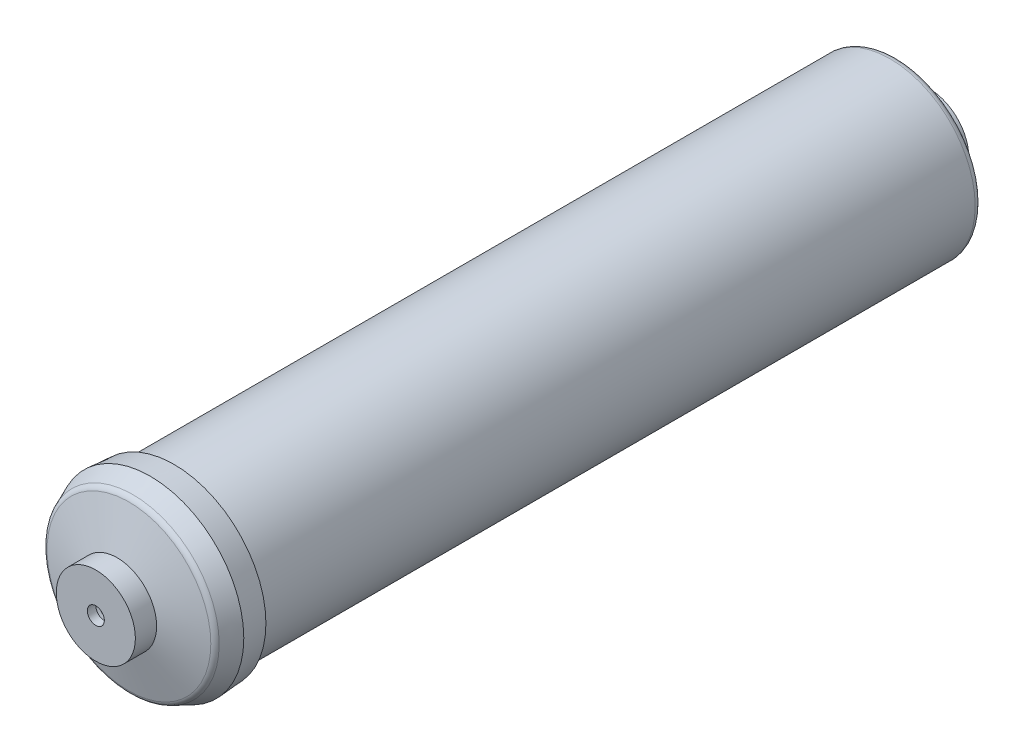
ISO-10303-21;
HEADER;
FILE_DESCRIPTION(('STEP AP214'),'2;1');
FILE_NAME('part.step','',(''),(''),'','','');
FILE_SCHEMA(('AUTOMOTIVE_DESIGN { 1 0 10303 214 1 1 1 1 }'));
ENDSEC;
DATA;
#1=APPLICATION_CONTEXT('core data for automotive mechanical design processes');
#2=APPLICATION_PROTOCOL_DEFINITION('international standard','automotive_design',2000,#1);
#3=PRODUCT_CONTEXT('',#1,'mechanical');
#4=PRODUCT('Part','Part','',(#3));
#5=PRODUCT_RELATED_PRODUCT_CATEGORY('part','',(#4));
#6=PRODUCT_DEFINITION_FORMATION('','',#4);
#7=PRODUCT_DEFINITION_CONTEXT('part definition',#1,'design');
#8=PRODUCT_DEFINITION('design','',#6,#7);
#9=PRODUCT_DEFINITION_SHAPE('','',#8);
#10=(LENGTH_UNIT() NAMED_UNIT(*) SI_UNIT(.MILLI.,.METRE.));
#11=(NAMED_UNIT(*) PLANE_ANGLE_UNIT() SI_UNIT($,.RADIAN.));
#12=(NAMED_UNIT(*) SI_UNIT($,.STERADIAN.) SOLID_ANGLE_UNIT());
#13=UNCERTAINTY_MEASURE_WITH_UNIT(LENGTH_MEASURE(1.E-05),#10,'distance_accuracy_value','');
#14=(GEOMETRIC_REPRESENTATION_CONTEXT(3) GLOBAL_UNCERTAINTY_ASSIGNED_CONTEXT((#13)) GLOBAL_UNIT_ASSIGNED_CONTEXT((#10,
#11,#12)) REPRESENTATION_CONTEXT('',''));
#15=CARTESIAN_POINT('',(0.,0.,0.));
#16=DIRECTION('',(0.,0.,1.));
#17=DIRECTION('',(1.,0.,0.));
#18=AXIS2_PLACEMENT_3D('',#15,#16,#17);
#19=CARTESIAN_POINT('',(0.,3.175,-3.175));
#20=DIRECTION('',(0.,0.,1.));
#21=DIRECTION('',(1.,0.,0.));
#22=AXIS2_PLACEMENT_3D('',#19,#20,#21);
#23=PLANE('',#22);
#24=CARTESIAN_POINT('',(0.,0.,-3.175));
#25=DIRECTION('',(0.,0.,1.));
#26=DIRECTION('',(1.,0.,0.));
#27=AXIS2_PLACEMENT_3D('',#24,#25,#26);
#28=CIRCLE('',#27,11.58875);
#29=CARTESIAN_POINT('',(11.58875,0.,-3.175));
#30=VERTEX_POINT('',#29);
#31=EDGE_CURVE('E111',#30,#30,#28,.T.);
#32=ORIENTED_EDGE('',*,*,#31,.F.);
#33=EDGE_LOOP('',(#32));
#34=FACE_BOUND('',#33,.T.);
#35=CARTESIAN_POINT('',(0.,0.,-3.175));
#36=DIRECTION('',(0.,0.,1.));
#37=DIRECTION('',(1.,0.,0.));
#38=AXIS2_PLACEMENT_3D('',#35,#36,#37);
#39=CIRCLE('',#38,3.175);
#40=CARTESIAN_POINT('',(3.175,0.,-3.175));
#41=VERTEX_POINT('',#40);
#42=EDGE_CURVE('E54',#41,#41,#39,.T.);
#43=ORIENTED_EDGE('',*,*,#42,.T.);
#44=EDGE_LOOP('',(#43));
#45=FACE_BOUND('',#44,.T.);
#46=ADVANCED_FACE('F34',(#34,#45),#23,.F.);
#47=CARTESIAN_POINT('',(0.,0.,0.));
#48=DIRECTION('',(0.,0.,1.));
#49=DIRECTION('',(1.,0.,0.));
#50=AXIS2_PLACEMENT_3D('',#47,#48,#49);
#51=CYLINDRICAL_SURFACE('',#50,3.175);
#52=ORIENTED_EDGE('',*,*,#42,.F.);
#53=EDGE_LOOP('',(#52));
#54=FACE_BOUND('',#53,.T.);
#55=CARTESIAN_POINT('',(0.,0.,0.));
#56=DIRECTION('',(0.,0.,1.));
#57=DIRECTION('',(1.,0.,0.));
#58=AXIS2_PLACEMENT_3D('',#55,#56,#57);
#59=CIRCLE('',#58,3.175);
#60=CARTESIAN_POINT('',(3.175,0.,0.));
#61=VERTEX_POINT('',#60);
#62=EDGE_CURVE('E57',#61,#61,#59,.T.);
#63=ORIENTED_EDGE('',*,*,#62,.T.);
#64=EDGE_LOOP('',(#63));
#65=FACE_BOUND('',#64,.T.);
#66=ADVANCED_FACE('F119',(#54,#65),#51,.F.);
#67=CARTESIAN_POINT('',(0.,14.76375,0.));
#68=DIRECTION('',(0.,0.,-1.));
#69=DIRECTION('',(-1.,0.,0.));
#70=AXIS2_PLACEMENT_3D('',#67,#68,#69);
#71=PLANE('',#70);
#72=ORIENTED_EDGE('',*,*,#62,.F.);
#73=EDGE_LOOP('',(#72));
#74=FACE_BOUND('',#73,.T.);
#75=CARTESIAN_POINT('',(0.,0.,0.));
#76=DIRECTION('',(0.,0.,1.));
#77=DIRECTION('',(1.,0.,0.));
#78=AXIS2_PLACEMENT_3D('',#75,#76,#77);
#79=CIRCLE('',#78,14.76375);
#80=CARTESIAN_POINT('',(14.76375,0.,0.));
#81=VERTEX_POINT('',#80);
#82=EDGE_CURVE('E60',#81,#81,#79,.T.);
#83=ORIENTED_EDGE('',*,*,#82,.T.);
#84=EDGE_LOOP('',(#83));
#85=FACE_BOUND('',#84,.T.);
#86=ADVANCED_FACE('F125',(#74,#85),#71,.F.);
#87=CARTESIAN_POINT('',(0.,0.,0.));
#88=DIRECTION('',(0.,0.,1.));
#89=DIRECTION('',(1.,0.,0.));
#90=AXIS2_PLACEMENT_3D('',#87,#88,#89);
#91=CYLINDRICAL_SURFACE('',#90,14.76375);
#92=ORIENTED_EDGE('',*,*,#82,.F.);
#93=EDGE_LOOP('',(#92));
#94=FACE_BOUND('',#93,.T.);
#95=CARTESIAN_POINT('',(0.,0.,-7.9375));
#96=DIRECTION('',(0.,0.,1.));
#97=DIRECTION('',(1.,0.,0.));
#98=AXIS2_PLACEMENT_3D('',#95,#96,#97);
#99=CIRCLE('',#98,14.76375);
#100=CARTESIAN_POINT('',(14.76375,0.,-7.9375));
#101=VERTEX_POINT('',#100);
#102=EDGE_CURVE('E63',#101,#101,#99,.T.);
#103=ORIENTED_EDGE('',*,*,#102,.T.);
#104=EDGE_LOOP('',(#103));
#105=FACE_BOUND('',#104,.T.);
#106=ADVANCED_FACE('F131',(#94,#105),#91,.T.);
#107=CARTESIAN_POINT('',(0.,0.,-12.7));
#108=DIRECTION('',(0.,0.,-1.));
#109=DIRECTION('',(-1.,0.,0.));
#110=AXIS2_PLACEMENT_3D('',#107,#108,#109);
#111=CONICAL_SURFACE('',#110,31.75,1.29744100327146);
#112=CARTESIAN_POINT('',(0.,0.,-12.3676441461748));
#113=DIRECTION('',(0.,0.,1.));
#114=DIRECTION('',(1.,0.,0.));
#115=AXIS2_PLACEMENT_3D('',#112,#113,#114);
#116=CIRCLE('',#115,30.5645974546901);
#117=CARTESIAN_POINT('',(30.5645974546901,0.,-12.3676441461748));
#118=VERTEX_POINT('',#117);
#119=EDGE_CURVE('E49',#118,#118,#116,.T.);
#120=ORIENTED_EDGE('',*,*,#119,.T.);
#121=EDGE_LOOP('',(#120));
#122=FACE_BOUND('',#121,.T.);
#123=ORIENTED_EDGE('',*,*,#102,.F.);
#124=EDGE_LOOP('',(#123));
#125=FACE_BOUND('',#124,.T.);
#126=ADVANCED_FACE('F137',(#122,#125),#111,.T.);
#127=CARTESIAN_POINT('',(0.,0.,-20.32));
#128=DIRECTION('',(0.,0.,-1.));
#129=DIRECTION('',(-1.,0.,0.));
#130=AXIS2_PLACEMENT_3D('',#127,#128,#129);
#131=CONICAL_SURFACE('',#130,34.925,0.394791119699761);
#132=CARTESIAN_POINT('',(0.,0.,-13.8364121459205));
#133=DIRECTION('',(0.,0.,1.));
#134=DIRECTION('',(1.,0.,0.));
#135=AXIS2_PLACEMENT_3D('',#132,#133,#134);
#136=CIRCLE('',#135,32.2235050608002);
#137=CARTESIAN_POINT('',(32.2235050608002,0.,-13.8364121459205));
#138=VERTEX_POINT('',#137);
#139=EDGE_CURVE('E45',#138,#138,#136,.F.);
#140=ORIENTED_EDGE('',*,*,#139,.T.);
#141=EDGE_LOOP('',(#140));
#142=FACE_BOUND('',#141,.T.);
#143=CARTESIAN_POINT('',(0.,0.,-20.32));
#144=DIRECTION('',(0.,0.,1.));
#145=DIRECTION('',(1.,0.,0.));
#146=AXIS2_PLACEMENT_3D('',#143,#144,#145);
#147=CIRCLE('',#146,34.925);
#148=CARTESIAN_POINT('',(34.925,0.,-20.32));
#149=VERTEX_POINT('',#148);
#150=EDGE_CURVE('E66',#149,#149,#147,.T.);
#151=ORIENTED_EDGE('',*,*,#150,.T.);
#152=EDGE_LOOP('',(#151));
#153=FACE_BOUND('',#152,.T.);
#154=ADVANCED_FACE('F142',(#142,#153),#131,.T.);
#155=CARTESIAN_POINT('',(0.,0.,-29.21));
#156=DIRECTION('',(0.,0.,1.));
#157=DIRECTION('',(1.,0.,0.));
#158=AXIS2_PLACEMENT_3D('',#155,#156,#157);
#159=CONICAL_SURFACE('',#158,34.29,0.07130746478529);
#160=ORIENTED_EDGE('',*,*,#150,.F.);
#161=EDGE_LOOP('',(#160));
#162=FACE_BOUND('',#161,.T.);
#163=CARTESIAN_POINT('',(0.,0.,-29.21));
#164=DIRECTION('',(0.,0.,1.));
#165=DIRECTION('',(1.,0.,0.));
#166=AXIS2_PLACEMENT_3D('',#163,#164,#165);
#167=CIRCLE('',#166,34.29);
#168=CARTESIAN_POINT('',(34.29,0.,-29.21));
#169=VERTEX_POINT('',#168);
#170=EDGE_CURVE('E69',#169,#169,#167,.T.);
#171=ORIENTED_EDGE('',*,*,#170,.T.);
#172=EDGE_LOOP('',(#171));
#173=FACE_BOUND('',#172,.T.);
#174=ADVANCED_FACE('F148',(#162,#173),#159,.T.);
#175=CARTESIAN_POINT('',(0.,34.29,-29.21));
#176=DIRECTION('',(0.,0.,1.));
#177=DIRECTION('',(1.,0.,0.));
#178=AXIS2_PLACEMENT_3D('',#175,#176,#177);
#179=PLANE('',#178);
#180=ORIENTED_EDGE('',*,*,#170,.F.);
#181=EDGE_LOOP('',(#180));
#182=FACE_BOUND('',#181,.T.);
#183=CARTESIAN_POINT('',(0.,0.,-29.21));
#184=DIRECTION('',(0.,0.,1.));
#185=DIRECTION('',(1.,0.,0.));
#186=AXIS2_PLACEMENT_3D('',#183,#184,#185);
#187=CIRCLE('',#186,31.75);
#188=CARTESIAN_POINT('',(31.75,0.,-29.21));
#189=VERTEX_POINT('',#188);
#190=EDGE_CURVE('E72',#189,#189,#187,.T.);
#191=ORIENTED_EDGE('',*,*,#190,.T.);
#192=EDGE_LOOP('',(#191));
#193=FACE_BOUND('',#192,.T.);
#194=ADVANCED_FACE('F171',(#182,#193),#179,.F.);
#195=CARTESIAN_POINT('',(0.,0.,0.));
#196=DIRECTION('',(0.,0.,1.));
#197=DIRECTION('',(1.,0.,0.));
#198=AXIS2_PLACEMENT_3D('',#195,#196,#197);
#199=CYLINDRICAL_SURFACE('',#198,31.75);
#200=CARTESIAN_POINT('',(0.,0.,-296.524203938704));
#201=DIRECTION('',(0.,0.,-1.));
#202=DIRECTION('',(-1.,0.,0.));
#203=AXIS2_PLACEMENT_3D('',#200,#201,#202);
#204=CIRCLE('',#203,31.75);
#205=CARTESIAN_POINT('',(-31.75,0.,-296.524203938704));
#206=VERTEX_POINT('',#205);
#207=EDGE_CURVE('E41',#206,#206,#204,.F.);
#208=ORIENTED_EDGE('',*,*,#207,.T.);
#209=EDGE_LOOP('',(#208));
#210=FACE_BOUND('',#209,.T.);
#211=ORIENTED_EDGE('',*,*,#190,.F.);
#212=EDGE_LOOP('',(#211));
#213=FACE_BOUND('',#212,.T.);
#214=ADVANCED_FACE('F176',(#210,#213),#199,.T.);
#215=CARTESIAN_POINT('',(0.,0.,-303.2125));
#216=DIRECTION('',(0.,0.,1.));
#217=DIRECTION('',(1.,0.,0.));
#218=AXIS2_PLACEMENT_3D('',#215,#216,#217);
#219=CONICAL_SURFACE('',#218,14.76375,1.29744100327146);
#220=CARTESIAN_POINT('',(0.,0.,-298.969895015372));
#221=DIRECTION('',(0.,0.,-1.));
#222=DIRECTION('',(-1.,0.,0.));
#223=AXIS2_PLACEMENT_3D('',#220,#221,#222);
#224=CIRCLE('',#223,29.8957077785053);
#225=CARTESIAN_POINT('',(-29.8957077785053,0.,-298.969895015372));
#226=VERTEX_POINT('',#225);
#227=EDGE_CURVE('E10',#226,#226,#224,.T.);
#228=ORIENTED_EDGE('',*,*,#227,.T.);
#229=EDGE_LOOP('',(#228));
#230=FACE_BOUND('',#229,.T.);
#231=CARTESIAN_POINT('',(0.,0.,-303.2125));
#232=DIRECTION('',(0.,0.,1.));
#233=DIRECTION('',(1.,0.,0.));
#234=AXIS2_PLACEMENT_3D('',#231,#232,#233);
#235=CIRCLE('',#234,14.76375);
#236=CARTESIAN_POINT('',(14.76375,0.,-303.2125));
#237=VERTEX_POINT('',#236);
#238=EDGE_CURVE('E75',#237,#237,#235,.T.);
#239=ORIENTED_EDGE('',*,*,#238,.T.);
#240=EDGE_LOOP('',(#239));
#241=FACE_BOUND('',#240,.T.);
#242=ADVANCED_FACE('F181',(#230,#241),#219,.T.);
#243=CARTESIAN_POINT('',(0.,0.,0.));
#244=DIRECTION('',(0.,0.,1.));
#245=DIRECTION('',(1.,0.,0.));
#246=AXIS2_PLACEMENT_3D('',#243,#244,#245);
#247=CYLINDRICAL_SURFACE('',#246,14.76375);
#248=ORIENTED_EDGE('',*,*,#238,.F.);
#249=EDGE_LOOP('',(#248));
#250=FACE_BOUND('',#249,.T.);
#251=CARTESIAN_POINT('',(0.,0.,-311.15));
#252=DIRECTION('',(0.,0.,1.));
#253=DIRECTION('',(1.,0.,0.));
#254=AXIS2_PLACEMENT_3D('',#251,#252,#253);
#255=CIRCLE('',#254,14.76375);
#256=CARTESIAN_POINT('',(14.76375,0.,-311.15));
#257=VERTEX_POINT('',#256);
#258=EDGE_CURVE('E78',#257,#257,#255,.T.);
#259=ORIENTED_EDGE('',*,*,#258,.T.);
#260=EDGE_LOOP('',(#259));
#261=FACE_BOUND('',#260,.T.);
#262=ADVANCED_FACE('F186',(#250,#261),#247,.T.);
#263=CARTESIAN_POINT('',(0.,3.175,-311.15));
#264=DIRECTION('',(0.,0.,1.));
#265=DIRECTION('',(1.,0.,0.));
#266=AXIS2_PLACEMENT_3D('',#263,#264,#265);
#267=PLANE('',#266);
#268=ORIENTED_EDGE('',*,*,#258,.F.);
#269=EDGE_LOOP('',(#268));
#270=FACE_BOUND('',#269,.T.);
#271=CARTESIAN_POINT('',(0.,0.,-311.15));
#272=DIRECTION('',(0.,0.,1.));
#273=DIRECTION('',(1.,0.,0.));
#274=AXIS2_PLACEMENT_3D('',#271,#272,#273);
#275=CIRCLE('',#274,3.175);
#276=CARTESIAN_POINT('',(3.175,0.,-311.15));
#277=VERTEX_POINT('',#276);
#278=EDGE_CURVE('E81',#277,#277,#275,.T.);
#279=ORIENTED_EDGE('',*,*,#278,.T.);
#280=EDGE_LOOP('',(#279));
#281=FACE_BOUND('',#280,.T.);
#282=ADVANCED_FACE('F191',(#270,#281),#267,.F.);
#283=CARTESIAN_POINT('',(0.,0.,0.));
#284=DIRECTION('',(0.,0.,1.));
#285=DIRECTION('',(1.,0.,0.));
#286=AXIS2_PLACEMENT_3D('',#283,#284,#285);
#287=CYLINDRICAL_SURFACE('',#286,3.175);
#288=ORIENTED_EDGE('',*,*,#278,.F.);
#289=EDGE_LOOP('',(#288));
#290=FACE_BOUND('',#289,.T.);
#291=CARTESIAN_POINT('',(0.,0.,-307.975));
#292=DIRECTION('',(0.,0.,1.));
#293=DIRECTION('',(1.,0.,0.));
#294=AXIS2_PLACEMENT_3D('',#291,#292,#293);
#295=CIRCLE('',#294,3.175);
#296=CARTESIAN_POINT('',(3.175,0.,-307.975));
#297=VERTEX_POINT('',#296);
#298=EDGE_CURVE('E84',#297,#297,#295,.T.);
#299=ORIENTED_EDGE('',*,*,#298,.T.);
#300=EDGE_LOOP('',(#299));
#301=FACE_BOUND('',#300,.T.);
#302=ADVANCED_FACE('F195',(#290,#301),#287,.F.);
#303=CARTESIAN_POINT('',(0.,11.58875,-307.975));
#304=DIRECTION('',(0.,0.,-1.));
#305=DIRECTION('',(-1.,0.,0.));
#306=AXIS2_PLACEMENT_3D('',#303,#304,#305);
#307=PLANE('',#306);
#308=ORIENTED_EDGE('',*,*,#298,.F.);
#309=EDGE_LOOP('',(#308));
#310=FACE_BOUND('',#309,.T.);
#311=CARTESIAN_POINT('',(0.,0.,-307.975));
#312=DIRECTION('',(0.,0.,1.));
#313=DIRECTION('',(1.,0.,0.));
#314=AXIS2_PLACEMENT_3D('',#311,#312,#313);
#315=CIRCLE('',#314,11.58875);
#316=CARTESIAN_POINT('',(11.58875,0.,-307.975));
#317=VERTEX_POINT('',#316);
#318=EDGE_CURVE('E87',#317,#317,#315,.T.);
#319=ORIENTED_EDGE('',*,*,#318,.T.);
#320=EDGE_LOOP('',(#319));
#321=FACE_BOUND('',#320,.T.);
#322=ADVANCED_FACE('F199',(#310,#321),#307,.F.);
#323=CARTESIAN_POINT('',(0.,0.,0.));
#324=DIRECTION('',(0.,0.,1.));
#325=DIRECTION('',(1.,0.,0.));
#326=AXIS2_PLACEMENT_3D('',#323,#324,#325);
#327=CYLINDRICAL_SURFACE('',#326,11.58875);
#328=ORIENTED_EDGE('',*,*,#318,.F.);
#329=EDGE_LOOP('',(#328));
#330=FACE_BOUND('',#329,.T.);
#331=CARTESIAN_POINT('',(0.,0.,-300.805254923379));
#332=DIRECTION('',(0.,0.,1.));
#333=DIRECTION('',(1.,0.,0.));
#334=AXIS2_PLACEMENT_3D('',#331,#332,#333);
#335=CIRCLE('',#334,11.58875);
#336=CARTESIAN_POINT('',(11.58875,0.,-300.805254923379));
#337=VERTEX_POINT('',#336);
#338=EDGE_CURVE('E90',#337,#337,#335,.T.);
#339=ORIENTED_EDGE('',*,*,#338,.T.);
#340=EDGE_LOOP('',(#339));
#341=FACE_BOUND('',#340,.T.);
#342=ADVANCED_FACE('F203',(#330,#341),#327,.F.);
#343=CARTESIAN_POINT('',(0.,0.,-296.04275492338));
#344=DIRECTION('',(0.,0.,1.));
#345=DIRECTION('',(1.,0.,0.));
#346=AXIS2_PLACEMENT_3D('',#343,#344,#345);
#347=CONICAL_SURFACE('',#346,28.575,1.29744100327146);
#348=ORIENTED_EDGE('',*,*,#338,.F.);
#349=EDGE_LOOP('',(#348));
#350=FACE_BOUND('',#349,.T.);
#351=CARTESIAN_POINT('',(0.,0.,-296.04275492338));
#352=DIRECTION('',(0.,0.,1.));
#353=DIRECTION('',(1.,0.,0.));
#354=AXIS2_PLACEMENT_3D('',#351,#352,#353);
#355=CIRCLE('',#354,28.575);
#356=CARTESIAN_POINT('',(28.575,0.,-296.04275492338));
#357=VERTEX_POINT('',#356);
#358=EDGE_CURVE('E93',#357,#357,#355,.T.);
#359=ORIENTED_EDGE('',*,*,#358,.T.);
#360=EDGE_LOOP('',(#359));
#361=FACE_BOUND('',#360,.T.);
#362=ADVANCED_FACE('F207',(#350,#361),#347,.F.);
#363=CARTESIAN_POINT('',(0.,0.,0.));
#364=DIRECTION('',(0.,0.,1.));
#365=DIRECTION('',(1.,0.,0.));
#366=AXIS2_PLACEMENT_3D('',#363,#364,#365);
#367=CYLINDRICAL_SURFACE('',#366,28.575);
#368=ORIENTED_EDGE('',*,*,#358,.F.);
#369=EDGE_LOOP('',(#368));
#370=FACE_BOUND('',#369,.T.);
#371=CARTESIAN_POINT('',(0.,0.,-26.035));
#372=DIRECTION('',(0.,0.,1.));
#373=DIRECTION('',(1.,0.,0.));
#374=AXIS2_PLACEMENT_3D('',#371,#372,#373);
#375=CIRCLE('',#374,28.575);
#376=CARTESIAN_POINT('',(28.575,0.,-26.035));
#377=VERTEX_POINT('',#376);
#378=EDGE_CURVE('E96',#377,#377,#375,.T.);
#379=ORIENTED_EDGE('',*,*,#378,.T.);
#380=EDGE_LOOP('',(#379));
#381=FACE_BOUND('',#380,.T.);
#382=ADVANCED_FACE('F211',(#370,#381),#367,.F.);
#383=CARTESIAN_POINT('',(0.,31.3336965292009,-26.035));
#384=DIRECTION('',(0.,0.,-1.));
#385=DIRECTION('',(-1.,0.,0.));
#386=AXIS2_PLACEMENT_3D('',#383,#384,#385);
#387=PLANE('',#386);
#388=ORIENTED_EDGE('',*,*,#378,.F.);
#389=EDGE_LOOP('',(#388));
#390=FACE_BOUND('',#389,.T.);
#391=CARTESIAN_POINT('',(0.,0.,-26.035));
#392=DIRECTION('',(0.,0.,1.));
#393=DIRECTION('',(1.,0.,0.));
#394=AXIS2_PLACEMENT_3D('',#391,#392,#393);
#395=CIRCLE('',#394,31.3336965292009);
#396=CARTESIAN_POINT('',(31.3336965292009,0.,-26.035));
#397=VERTEX_POINT('',#396);
#398=EDGE_CURVE('E99',#397,#397,#395,.T.);
#399=ORIENTED_EDGE('',*,*,#398,.T.);
#400=EDGE_LOOP('',(#399));
#401=FACE_BOUND('',#400,.T.);
#402=ADVANCED_FACE('F215',(#390,#401),#387,.F.);
#403=CARTESIAN_POINT('',(0.,0.,-20.8455002061676));
#404=DIRECTION('',(0.,0.,1.));
#405=DIRECTION('',(1.,0.,0.));
#406=AXIS2_PLACEMENT_3D('',#403,#404,#405);
#407=CONICAL_SURFACE('',#406,31.7043750859032,0.0713074647852898);
#408=ORIENTED_EDGE('',*,*,#398,.F.);
#409=EDGE_LOOP('',(#408));
#410=FACE_BOUND('',#409,.T.);
#411=CARTESIAN_POINT('',(0.,0.,-20.8455002061676));
#412=DIRECTION('',(0.,0.,1.));
#413=DIRECTION('',(1.,0.,0.));
#414=AXIS2_PLACEMENT_3D('',#411,#412,#413);
#415=CIRCLE('',#414,31.7043750859032);
#416=CARTESIAN_POINT('',(31.7043750859032,0.,-20.8455002061676));
#417=VERTEX_POINT('',#416);
#418=EDGE_CURVE('E102',#417,#417,#415,.T.);
#419=ORIENTED_EDGE('',*,*,#418,.T.);
#420=EDGE_LOOP('',(#419));
#421=FACE_BOUND('',#420,.T.);
#422=ADVANCED_FACE('F219',(#410,#421),#407,.F.);
#423=CARTESIAN_POINT('',(0.,0.,-15.3416690285545));
#424=DIRECTION('',(0.,0.,-1.));
#425=DIRECTION('',(-1.,0.,0.));
#426=AXIS2_PLACEMENT_3D('',#423,#424,#425);
#427=CONICAL_SURFACE('',#426,29.411112095231,0.394791119699761);
#428=ORIENTED_EDGE('',*,*,#418,.F.);
#429=EDGE_LOOP('',(#428));
#430=FACE_BOUND('',#429,.T.);
#431=CARTESIAN_POINT('',(0.,0.,-15.3416690285545));
#432=DIRECTION('',(0.,0.,1.));
#433=DIRECTION('',(1.,0.,0.));
#434=AXIS2_PLACEMENT_3D('',#431,#432,#433);
#435=CIRCLE('',#434,29.411112095231);
#436=CARTESIAN_POINT('',(29.411112095231,0.,-15.3416690285545));
#437=VERTEX_POINT('',#436);
#438=EDGE_CURVE('E105',#437,#437,#435,.T.);
#439=ORIENTED_EDGE('',*,*,#438,.T.);
#440=EDGE_LOOP('',(#439));
#441=FACE_BOUND('',#440,.T.);
#442=ADVANCED_FACE('F223',(#430,#441),#427,.F.);
#443=CARTESIAN_POINT('',(0.,0.,-10.3447450766206));
#444=DIRECTION('',(0.,0.,-1.));
#445=DIRECTION('',(-1.,0.,0.));
#446=AXIS2_PLACEMENT_3D('',#443,#444,#445);
#447=CONICAL_SURFACE('',#446,11.58875,1.29744100327146);
#448=ORIENTED_EDGE('',*,*,#438,.F.);
#449=EDGE_LOOP('',(#448));
#450=FACE_BOUND('',#449,.T.);
#451=CARTESIAN_POINT('',(0.,0.,-10.3447450766206));
#452=DIRECTION('',(0.,0.,1.));
#453=DIRECTION('',(1.,0.,0.));
#454=AXIS2_PLACEMENT_3D('',#451,#452,#453);
#455=CIRCLE('',#454,11.58875);
#456=CARTESIAN_POINT('',(11.58875,0.,-10.3447450766206));
#457=VERTEX_POINT('',#456);
#458=EDGE_CURVE('E108',#457,#457,#455,.T.);
#459=ORIENTED_EDGE('',*,*,#458,.T.);
#460=EDGE_LOOP('',(#459));
#461=FACE_BOUND('',#460,.T.);
#462=ADVANCED_FACE('F160',(#450,#461),#447,.F.);
#463=CARTESIAN_POINT('',(0.,0.,0.));
#464=DIRECTION('',(0.,0.,1.));
#465=DIRECTION('',(1.,0.,0.));
#466=AXIS2_PLACEMENT_3D('',#463,#464,#465);
#467=CYLINDRICAL_SURFACE('',#466,11.58875);
#468=ORIENTED_EDGE('',*,*,#458,.F.);
#469=EDGE_LOOP('',(#468));
#470=FACE_BOUND('',#469,.T.);
#471=ORIENTED_EDGE('',*,*,#31,.T.);
#472=EDGE_LOOP('',(#471));
#473=FACE_BOUND('',#472,.T.);
#474=ADVANCED_FACE('F115',(#470,#473),#467,.F.);
#475=CARTESIAN_POINT('',(0.,0.,-14.8133352228436));
#476=DIRECTION('',(0.,0.,-1.));
#477=DIRECTION('',(-1.,0.,0.));
#478=AXIS2_PLACEMENT_3D('',#475,#476,#477);
#479=TOROIDAL_SURFACE('',#478,29.8788896761848,2.54);
#480=ORIENTED_EDGE('',*,*,#139,.F.);
#481=EDGE_LOOP('',(#480));
#482=FACE_BOUND('',#481,.T.);
#483=ORIENTED_EDGE('',*,*,#119,.F.);
#484=EDGE_LOOP('',(#483));
#485=FACE_BOUND('',#484,.T.);
#486=ADVANCED_FACE('F152',(#482,#485),#479,.T.);
#487=CARTESIAN_POINT('',(0.,0.,-296.524203938704));
#488=DIRECTION('',(0.,0.,-1.));
#489=DIRECTION('',(-1.,0.,0.));
#490=AXIS2_PLACEMENT_3D('',#487,#488,#489);
#491=TOROIDAL_SURFACE('',#490,29.21,2.54);
#492=ORIENTED_EDGE('',*,*,#227,.F.);
#493=EDGE_LOOP('',(#492));
#494=FACE_BOUND('',#493,.T.);
#495=ORIENTED_EDGE('',*,*,#207,.F.);
#496=EDGE_LOOP('',(#495));
#497=FACE_BOUND('',#496,.T.);
#498=ADVANCED_FACE('F36',(#494,#497),#491,.T.);
#499=CLOSED_SHELL('',(#46,#66,#86,#106,#126,#154,#174,#194,#214,#242,#262,#282,#302,#322,#342,
#362,#382,#402,#422,#442,#462,#474,#486,#498));
#500=MANIFOLD_SOLID_BREP('B2',#499);
#501=ADVANCED_BREP_SHAPE_REPRESENTATION('',(#18,#500),#14);
#502=SHAPE_DEFINITION_REPRESENTATION(#9,#501);
ENDSEC;
END-ISO-10303-21;
